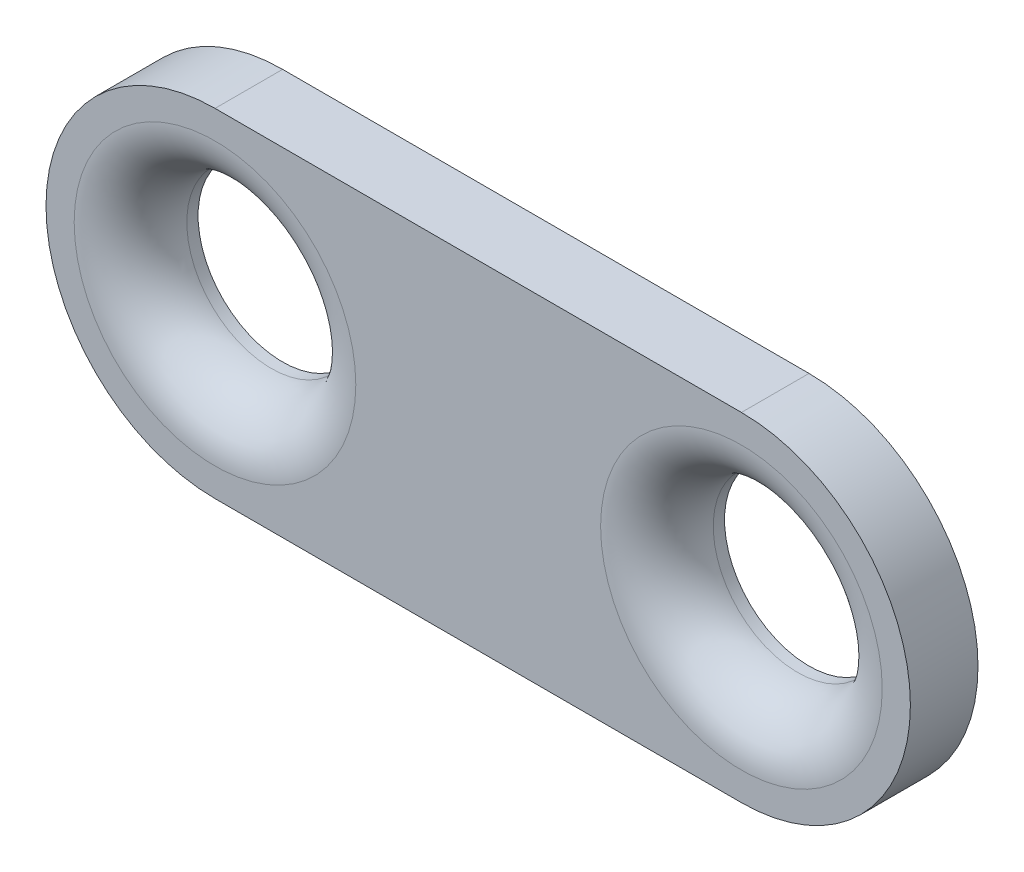
ISO-10303-21;
HEADER;
FILE_DESCRIPTION(('STEP AP214'),'2;1');
FILE_NAME('part.step','',(''),(''),'','','');
FILE_SCHEMA(('AUTOMOTIVE_DESIGN { 1 0 10303 214 1 1 1 1 }'));
ENDSEC;
DATA;
#1=APPLICATION_CONTEXT('core data for automotive mechanical design processes');
#2=APPLICATION_PROTOCOL_DEFINITION('international standard','automotive_design',2000,#1);
#3=PRODUCT_CONTEXT('',#1,'mechanical');
#4=PRODUCT('Part','Part','',(#3));
#5=PRODUCT_RELATED_PRODUCT_CATEGORY('part','',(#4));
#6=PRODUCT_DEFINITION_FORMATION('','',#4);
#7=PRODUCT_DEFINITION_CONTEXT('part definition',#1,'design');
#8=PRODUCT_DEFINITION('design','',#6,#7);
#9=PRODUCT_DEFINITION_SHAPE('','',#8);
#10=(LENGTH_UNIT() NAMED_UNIT(*) SI_UNIT(.MILLI.,.METRE.));
#11=(NAMED_UNIT(*) PLANE_ANGLE_UNIT() SI_UNIT($,.RADIAN.));
#12=(NAMED_UNIT(*) SI_UNIT($,.STERADIAN.) SOLID_ANGLE_UNIT());
#13=UNCERTAINTY_MEASURE_WITH_UNIT(LENGTH_MEASURE(1.E-05),#10,'distance_accuracy_value','');
#14=(GEOMETRIC_REPRESENTATION_CONTEXT(3) GLOBAL_UNCERTAINTY_ASSIGNED_CONTEXT((#13)) GLOBAL_UNIT_ASSIGNED_CONTEXT((#10,
#11,#12)) REPRESENTATION_CONTEXT('',''));
#15=CARTESIAN_POINT('',(0.,0.,0.));
#16=DIRECTION('',(0.,0.,1.));
#17=DIRECTION('',(1.,0.,0.));
#18=AXIS2_PLACEMENT_3D('',#15,#16,#17);
#19=CARTESIAN_POINT('',(-4.67293971887148,0.0010123730508192,1.2));
#20=DIRECTION('',(0.,0.,1.));
#21=DIRECTION('',(1.,0.,0.));
#22=AXIS2_PLACEMENT_3D('',#19,#20,#21);
#23=PLANE('',#22);
#24=CARTESIAN_POINT('',(4.67293971887147,-0.00101237305081964,1.2));
#25=DIRECTION('',(0.,0.,1.));
#26=DIRECTION('',(1.,0.,0.));
#27=AXIS2_PLACEMENT_3D('',#24,#25,#26);
#28=CIRCLE('',#27,2.5);
#29=CARTESIAN_POINT('',(7.17293971887147,-0.00101237305081964,1.2));
#30=VERTEX_POINT('',#29);
#31=EDGE_CURVE('E52',#30,#30,#28,.F.);
#32=ORIENTED_EDGE('',*,*,#31,.T.);
#33=EDGE_LOOP('',(#32));
#34=FACE_BOUND('',#33,.T.);
#35=CARTESIAN_POINT('',(-4.67293971887148,0.0010123730508192,1.2));
#36=DIRECTION('',(0.,0.,1.));
#37=DIRECTION('',(1.,0.,0.));
#38=AXIS2_PLACEMENT_3D('',#35,#36,#37);
#39=CIRCLE('',#38,2.5);
#40=CARTESIAN_POINT('',(-2.17293971887148,0.0010123730508192,1.2));
#41=VERTEX_POINT('',#40);
#42=EDGE_CURVE('E138',#41,#41,#39,.F.);
#43=ORIENTED_EDGE('',*,*,#42,.T.);
#44=EDGE_LOOP('',(#43));
#45=FACE_BOUND('',#44,.T.);
#46=DIRECTION('',(0.999999976532286,-0.000216645856348778,0.));
#47=VECTOR('',#46,1.);
#48=CARTESIAN_POINT('',(4.67247607825271,-3.00101233722372,1.2));
#49=LINE('',#48,#47);
#50=CARTESIAN_POINT('',(-4.67358965643928,-2.99898755076162,1.2));
#51=VERTEX_POINT('',#50);
#52=CARTESIAN_POINT('',(4.67247607825271,-3.00101233722372,1.2));
#53=VERTEX_POINT('',#52);
#54=EDGE_CURVE('E104',#51,#53,#49,.T.);
#55=ORIENTED_EDGE('',*,*,#54,.T.);
#56=CARTESIAN_POINT('',(4.67293971887147,-0.00101237305081964,1.2));
#57=DIRECTION('',(0.,0.,1.));
#58=DIRECTION('',(1.,0.,0.));
#59=AXIS2_PLACEMENT_3D('',#56,#57,#58);
#60=CIRCLE('',#59,3.);
#61=CARTESIAN_POINT('',(4.67340335949023,2.99898759112208,1.2));
#62=VERTEX_POINT('',#61);
#63=EDGE_CURVE('E92',#53,#62,#60,.T.);
#64=ORIENTED_EDGE('',*,*,#63,.T.);
#65=DIRECTION('',(-0.999999976532286,0.000216645856348858,0.));
#66=VECTOR('',#65,1.);
#67=CARTESIAN_POINT('',(-4.67210348434781,3.00101225650279,1.2));
#68=LINE('',#67,#66);
#69=CARTESIAN_POINT('',(-4.67210348434781,3.00101225650279,1.2));
#70=VERTEX_POINT('',#69);
#71=EDGE_CURVE('E103',#62,#70,#68,.T.);
#72=ORIENTED_EDGE('',*,*,#71,.T.);
#73=CARTESIAN_POINT('',(-4.67293971887148,0.0010123730508192,1.2));
#74=DIRECTION('',(0.,0.,1.));
#75=DIRECTION('',(1.,0.,0.));
#76=AXIS2_PLACEMENT_3D('',#73,#74,#75);
#77=CIRCLE('',#76,3.);
#78=EDGE_CURVE('E67',#70,#51,#77,.T.);
#79=ORIENTED_EDGE('',*,*,#78,.T.);
#80=EDGE_LOOP('',(#55,#64,#72,#79));
#81=FACE_BOUND('',#80,.T.);
#82=ADVANCED_FACE('F43',(#34,#45,#81),#23,.T.);
#83=CARTESIAN_POINT('',(-4.67293971887148,0.0010123730508192,0.));
#84=DIRECTION('',(0.,0.,1.));
#85=DIRECTION('',(1.,0.,0.));
#86=AXIS2_PLACEMENT_3D('',#83,#84,#85);
#87=PLANE('',#86);
#88=CARTESIAN_POINT('',(4.67293971887147,-0.00101237305081964,0.));
#89=DIRECTION('',(0.,0.,1.));
#90=DIRECTION('',(1.,0.,0.));
#91=AXIS2_PLACEMENT_3D('',#88,#89,#90);
#92=CIRCLE('',#91,3.);
#93=CARTESIAN_POINT('',(4.67247607825271,-3.00101233722372,0.));
#94=VERTEX_POINT('',#93);
#95=CARTESIAN_POINT('',(4.67340335949023,2.99898759112208,0.));
#96=VERTEX_POINT('',#95);
#97=EDGE_CURVE('E95',#94,#96,#92,.T.);
#98=ORIENTED_EDGE('',*,*,#97,.F.);
#99=DIRECTION('',(0.999999976532286,-0.000216645856348778,0.));
#100=VECTOR('',#99,1.);
#101=CARTESIAN_POINT('',(4.67247607825271,-3.00101233722372,0.));
#102=LINE('',#101,#100);
#103=CARTESIAN_POINT('',(-4.67358965643928,-2.99898755076162,0.));
#104=VERTEX_POINT('',#103);
#105=EDGE_CURVE('E109',#104,#94,#102,.T.);
#106=ORIENTED_EDGE('',*,*,#105,.F.);
#107=CARTESIAN_POINT('',(-4.67293971887148,0.0010123730508192,0.));
#108=DIRECTION('',(0.,0.,1.));
#109=DIRECTION('',(1.,0.,0.));
#110=AXIS2_PLACEMENT_3D('',#107,#108,#109);
#111=CIRCLE('',#110,3.);
#112=CARTESIAN_POINT('',(-4.67210348434781,3.00101225650279,0.));
#113=VERTEX_POINT('',#112);
#114=EDGE_CURVE('E59',#113,#104,#111,.T.);
#115=ORIENTED_EDGE('',*,*,#114,.F.);
#116=DIRECTION('',(-0.999999976532286,0.000216645856348858,0.));
#117=VECTOR('',#116,1.);
#118=CARTESIAN_POINT('',(-4.67210348434781,3.00101225650279,0.));
#119=LINE('',#118,#117);
#120=EDGE_CURVE('E113',#96,#113,#119,.T.);
#121=ORIENTED_EDGE('',*,*,#120,.F.);
#122=EDGE_LOOP('',(#98,#106,#115,#121));
#123=FACE_BOUND('',#122,.T.);
#124=CARTESIAN_POINT('',(-4.67293971887148,0.0010123730508192,0.));
#125=DIRECTION('',(0.,0.,1.));
#126=DIRECTION('',(1.,0.,0.));
#127=AXIS2_PLACEMENT_3D('',#124,#125,#126);
#128=CIRCLE('',#127,1.5);
#129=CARTESIAN_POINT('',(-3.17293971887148,0.0010123730508192,0.));
#130=VERTEX_POINT('',#129);
#131=EDGE_CURVE('E120',#130,#130,#128,.T.);
#132=ORIENTED_EDGE('',*,*,#131,.T.);
#133=EDGE_LOOP('',(#132));
#134=FACE_BOUND('',#133,.T.);
#135=CARTESIAN_POINT('',(4.67293971887147,-0.00101237305081964,0.));
#136=DIRECTION('',(0.,0.,1.));
#137=DIRECTION('',(1.,0.,0.));
#138=AXIS2_PLACEMENT_3D('',#135,#136,#137);
#139=CIRCLE('',#138,1.5);
#140=CARTESIAN_POINT('',(6.17293971887147,-0.00101237305081964,0.));
#141=VERTEX_POINT('',#140);
#142=EDGE_CURVE('E115',#141,#141,#139,.T.);
#143=ORIENTED_EDGE('',*,*,#142,.T.);
#144=EDGE_LOOP('',(#143));
#145=FACE_BOUND('',#144,.T.);
#146=ADVANCED_FACE('F167',(#123,#134,#145),#87,.F.);
#147=CARTESIAN_POINT('',(-4.67293971887148,0.0010123730508192,1.2));
#148=DIRECTION('',(0.,0.,-1.));
#149=DIRECTION('',(-1.,0.,0.));
#150=AXIS2_PLACEMENT_3D('',#147,#148,#149);
#151=CYLINDRICAL_SURFACE('',#150,3.);
#152=ORIENTED_EDGE('',*,*,#78,.F.);
#153=DIRECTION('',(0.,0.,1.));
#154=VECTOR('',#153,1.);
#155=CARTESIAN_POINT('',(-4.67210348434781,3.00101225650279,0.));
#156=LINE('',#155,#154);
#157=EDGE_CURVE('E100',#113,#70,#156,.T.);
#158=ORIENTED_EDGE('',*,*,#157,.F.);
#159=ORIENTED_EDGE('',*,*,#114,.T.);
#160=DIRECTION('',(0.,0.,-1.));
#161=VECTOR('',#160,1.);
#162=CARTESIAN_POINT('',(-4.6735896564399,-2.99898755365383,1.2));
#163=LINE('',#162,#161);
#164=EDGE_CURVE('E129',#51,#104,#163,.T.);
#165=ORIENTED_EDGE('',*,*,#164,.F.);
#166=EDGE_LOOP('',(#152,#158,#159,#165));
#167=FACE_BOUND('',#166,.T.);
#168=ADVANCED_FACE('F165',(#167),#151,.T.);
#169=CARTESIAN_POINT('',(-4.67293971887148,0.0010123730508192,1.2));
#170=DIRECTION('',(0.,0.,-1.));
#171=DIRECTION('',(-1.,0.,0.));
#172=AXIS2_PLACEMENT_3D('',#169,#170,#171);
#173=CYLINDRICAL_SURFACE('',#172,1.5);
#174=CARTESIAN_POINT('',(-4.67293971887148,0.0010123730508192,0.2));
#175=DIRECTION('',(0.,0.,1.));
#176=DIRECTION('',(1.,0.,0.));
#177=AXIS2_PLACEMENT_3D('',#174,#175,#176);
#178=CIRCLE('',#177,1.5);
#179=CARTESIAN_POINT('',(-3.17293971887148,0.0010123730508192,0.2));
#180=VERTEX_POINT('',#179);
#181=EDGE_CURVE('E11',#180,#180,#178,.T.);
#182=ORIENTED_EDGE('',*,*,#181,.T.);
#183=EDGE_LOOP('',(#182));
#184=FACE_BOUND('',#183,.T.);
#185=ORIENTED_EDGE('',*,*,#131,.F.);
#186=EDGE_LOOP('',(#185));
#187=FACE_BOUND('',#186,.T.);
#188=ADVANCED_FACE('F178',(#184,#187),#173,.F.);
#189=CARTESIAN_POINT('',(-4.67210348434781,3.00101225650279,0.));
#190=DIRECTION('',(0.000216645856348859,0.999999976532286,0.));
#191=DIRECTION('',(-0.999999976532286,0.000216645856348859,0.));
#192=AXIS2_PLACEMENT_3D('',#189,#190,#191);
#193=PLANE('',#192);
#194=ORIENTED_EDGE('',*,*,#71,.F.);
#195=DIRECTION('',(0.,0.,1.));
#196=VECTOR('',#195,1.);
#197=CARTESIAN_POINT('',(4.67340335949023,2.99898759112208,0.));
#198=LINE('',#197,#196);
#199=EDGE_CURVE('E88',#96,#62,#198,.T.);
#200=ORIENTED_EDGE('',*,*,#199,.F.);
#201=ORIENTED_EDGE('',*,*,#120,.T.);
#202=ORIENTED_EDGE('',*,*,#157,.T.);
#203=EDGE_LOOP('',(#194,#200,#201,#202));
#204=FACE_BOUND('',#203,.T.);
#205=ADVANCED_FACE('F107',(#204),#193,.T.);
#206=CARTESIAN_POINT('',(4.67247607825271,-3.00101233722372,0.));
#207=DIRECTION('',(-0.000216645856348778,-0.999999976532286,0.));
#208=DIRECTION('',(0.999999976532286,-0.000216645856348778,0.));
#209=AXIS2_PLACEMENT_3D('',#206,#207,#208);
#210=PLANE('',#209);
#211=DIRECTION('',(0.,0.,1.));
#212=VECTOR('',#211,1.);
#213=CARTESIAN_POINT('',(4.67247607825271,-3.00101233722372,0.));
#214=LINE('',#213,#212);
#215=EDGE_CURVE('E101',#94,#53,#214,.T.);
#216=ORIENTED_EDGE('',*,*,#215,.T.);
#217=ORIENTED_EDGE('',*,*,#54,.F.);
#218=ORIENTED_EDGE('',*,*,#164,.T.);
#219=ORIENTED_EDGE('',*,*,#105,.T.);
#220=EDGE_LOOP('',(#216,#217,#218,#219));
#221=FACE_BOUND('',#220,.T.);
#222=ADVANCED_FACE('F170',(#221),#210,.T.);
#223=CARTESIAN_POINT('',(4.67293971887147,-0.00101237305081964,1.2));
#224=DIRECTION('',(0.,0.,-1.));
#225=DIRECTION('',(-1.,0.,0.));
#226=AXIS2_PLACEMENT_3D('',#223,#224,#225);
#227=CYLINDRICAL_SURFACE('',#226,3.);
#228=ORIENTED_EDGE('',*,*,#199,.T.);
#229=ORIENTED_EDGE('',*,*,#63,.F.);
#230=ORIENTED_EDGE('',*,*,#215,.F.);
#231=ORIENTED_EDGE('',*,*,#97,.T.);
#232=EDGE_LOOP('',(#228,#229,#230,#231));
#233=FACE_BOUND('',#232,.T.);
#234=ADVANCED_FACE('F90',(#233),#227,.T.);
#235=CARTESIAN_POINT('',(4.67293971887147,-0.00101237305081964,1.2));
#236=DIRECTION('',(0.,0.,-1.));
#237=DIRECTION('',(-1.,0.,0.));
#238=AXIS2_PLACEMENT_3D('',#235,#236,#237);
#239=CYLINDRICAL_SURFACE('',#238,1.5);
#240=CARTESIAN_POINT('',(4.67293971887147,-0.00101237305081964,0.2));
#241=DIRECTION('',(0.,0.,1.));
#242=DIRECTION('',(1.,0.,0.));
#243=AXIS2_PLACEMENT_3D('',#240,#241,#242);
#244=CIRCLE('',#243,1.5);
#245=CARTESIAN_POINT('',(6.17293971887147,-0.00101237305081964,0.2));
#246=VERTEX_POINT('',#245);
#247=EDGE_CURVE('E134',#246,#246,#244,.T.);
#248=ORIENTED_EDGE('',*,*,#247,.T.);
#249=EDGE_LOOP('',(#248));
#250=FACE_BOUND('',#249,.T.);
#251=ORIENTED_EDGE('',*,*,#142,.F.);
#252=EDGE_LOOP('',(#251));
#253=FACE_BOUND('',#252,.T.);
#254=ADVANCED_FACE('F150',(#250,#253),#239,.F.);
#255=CARTESIAN_POINT('',(4.67293971887147,-0.00101237305081964,0.2));
#256=DIRECTION('',(0.,0.,1.));
#257=DIRECTION('',(1.,0.,0.));
#258=AXIS2_PLACEMENT_3D('',#255,#256,#257);
#259=TOROIDAL_SURFACE('',#258,2.5,1.);
#260=ORIENTED_EDGE('',*,*,#31,.F.);
#261=EDGE_LOOP('',(#260));
#262=FACE_BOUND('',#261,.T.);
#263=ORIENTED_EDGE('',*,*,#247,.F.);
#264=EDGE_LOOP('',(#263));
#265=FACE_BOUND('',#264,.T.);
#266=ADVANCED_FACE('F147',(#262,#265),#259,.T.);
#267=CARTESIAN_POINT('',(-4.67293971887148,0.0010123730508192,0.2));
#268=DIRECTION('',(0.,0.,1.));
#269=DIRECTION('',(1.,0.,0.));
#270=AXIS2_PLACEMENT_3D('',#267,#268,#269);
#271=TOROIDAL_SURFACE('',#270,2.5,1.);
#272=ORIENTED_EDGE('',*,*,#42,.F.);
#273=EDGE_LOOP('',(#272));
#274=FACE_BOUND('',#273,.T.);
#275=ORIENTED_EDGE('',*,*,#181,.F.);
#276=EDGE_LOOP('',(#275));
#277=FACE_BOUND('',#276,.T.);
#278=ADVANCED_FACE('F45',(#274,#277),#271,.T.);
#279=CLOSED_SHELL('',(#82,#146,#168,#188,#205,#222,#234,#254,#266,#278));
#280=MANIFOLD_SOLID_BREP('B2',#279);
#281=ADVANCED_BREP_SHAPE_REPRESENTATION('',(#18,#280),#14);
#282=SHAPE_DEFINITION_REPRESENTATION(#9,#281);
ENDSEC;
END-ISO-10303-21;
